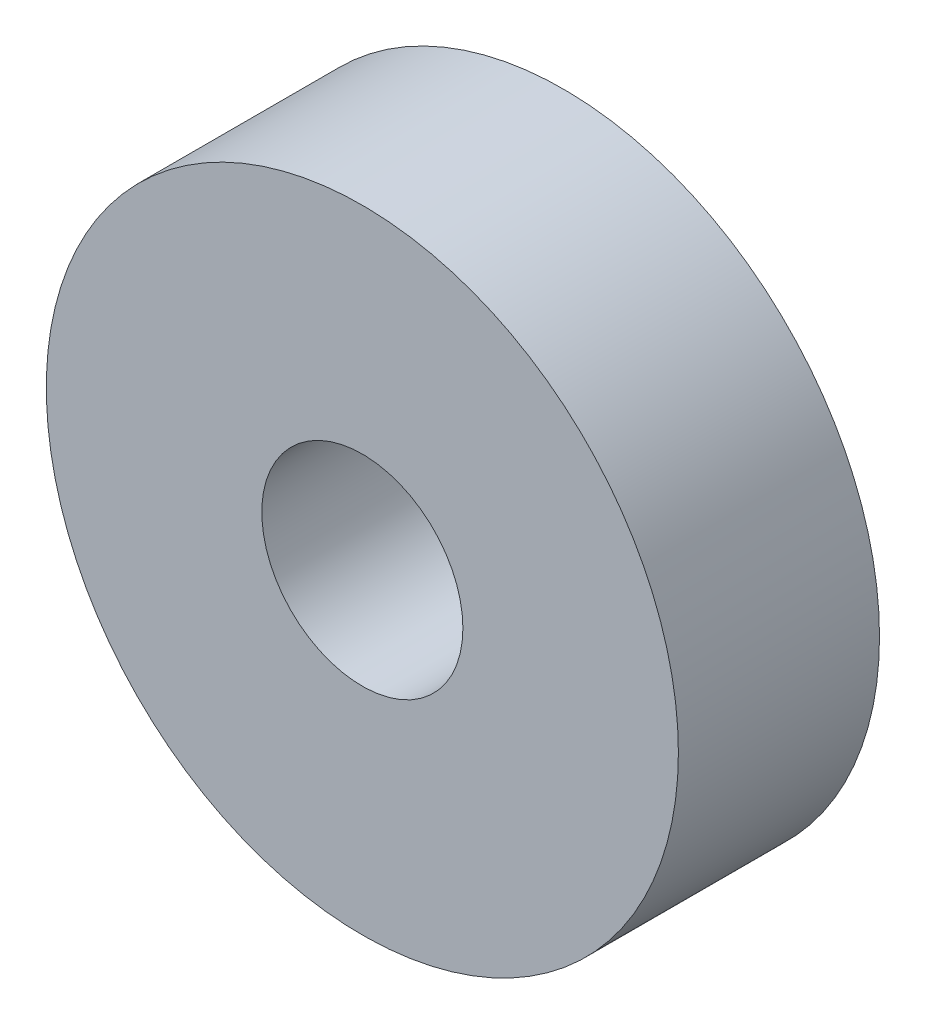
ISO-10303-21;
HEADER;
FILE_DESCRIPTION(('STEP AP214'),'2;1');
FILE_NAME('part.step','',(''),(''),'','','');
FILE_SCHEMA(('AUTOMOTIVE_DESIGN { 1 0 10303 214 1 1 1 1 }'));
ENDSEC;
DATA;
#1=APPLICATION_CONTEXT('core data for automotive mechanical design processes');
#2=APPLICATION_PROTOCOL_DEFINITION('international standard','automotive_design',2000,#1);
#3=PRODUCT_CONTEXT('',#1,'mechanical');
#4=PRODUCT('Part','Part','',(#3));
#5=PRODUCT_RELATED_PRODUCT_CATEGORY('part','',(#4));
#6=PRODUCT_DEFINITION_FORMATION('','',#4);
#7=PRODUCT_DEFINITION_CONTEXT('part definition',#1,'design');
#8=PRODUCT_DEFINITION('design','',#6,#7);
#9=PRODUCT_DEFINITION_SHAPE('','',#8);
#10=(LENGTH_UNIT() NAMED_UNIT(*) SI_UNIT(.MILLI.,.METRE.));
#11=(NAMED_UNIT(*) PLANE_ANGLE_UNIT() SI_UNIT($,.RADIAN.));
#12=(NAMED_UNIT(*) SI_UNIT($,.STERADIAN.) SOLID_ANGLE_UNIT());
#13=UNCERTAINTY_MEASURE_WITH_UNIT(LENGTH_MEASURE(1.E-05),#10,'distance_accuracy_value','');
#14=(GEOMETRIC_REPRESENTATION_CONTEXT(3) GLOBAL_UNCERTAINTY_ASSIGNED_CONTEXT((#13)) GLOBAL_UNIT_ASSIGNED_CONTEXT((#10,
#11,#12)) REPRESENTATION_CONTEXT('',''));
#15=CARTESIAN_POINT('',(0.,0.,0.));
#16=DIRECTION('',(0.,0.,1.));
#17=DIRECTION('',(1.,0.,0.));
#18=AXIS2_PLACEMENT_3D('',#15,#16,#17);
#19=CARTESIAN_POINT('',(0.,0.,3.5));
#20=DIRECTION('',(0.,0.,1.));
#21=DIRECTION('',(1.,0.,0.));
#22=AXIS2_PLACEMENT_3D('',#19,#20,#21);
#23=PLANE('',#22);
#24=CARTESIAN_POINT('',(0.,0.,3.5));
#25=DIRECTION('',(0.,0.,1.));
#26=DIRECTION('',(1.,0.,0.));
#27=AXIS2_PLACEMENT_3D('',#24,#25,#26);
#28=CIRCLE('',#27,11.);
#29=CARTESIAN_POINT('',(11.,0.,3.5));
#30=VERTEX_POINT('',#29);
#31=EDGE_CURVE('E10',#30,#30,#28,.T.);
#32=ORIENTED_EDGE('',*,*,#31,.T.);
#33=EDGE_LOOP('',(#32));
#34=FACE_BOUND('',#33,.T.);
#35=CARTESIAN_POINT('',(0.,0.,3.5));
#36=DIRECTION('',(0.,0.,1.));
#37=DIRECTION('',(1.,0.,0.));
#38=AXIS2_PLACEMENT_3D('',#35,#36,#37);
#39=CIRCLE('',#38,3.5);
#40=CARTESIAN_POINT('',(3.5,0.,3.5));
#41=VERTEX_POINT('',#40);
#42=EDGE_CURVE('E48',#41,#41,#39,.T.);
#43=ORIENTED_EDGE('',*,*,#42,.F.);
#44=EDGE_LOOP('',(#43));
#45=FACE_BOUND('',#44,.T.);
#46=ADVANCED_FACE('F37',(#34,#45),#23,.T.);
#47=CARTESIAN_POINT('',(0.,0.,-3.5));
#48=DIRECTION('',(0.,0.,1.));
#49=DIRECTION('',(1.,0.,0.));
#50=AXIS2_PLACEMENT_3D('',#47,#48,#49);
#51=PLANE('',#50);
#52=CARTESIAN_POINT('',(0.,0.,-3.5));
#53=DIRECTION('',(0.,0.,1.));
#54=DIRECTION('',(1.,0.,0.));
#55=AXIS2_PLACEMENT_3D('',#52,#53,#54);
#56=CIRCLE('',#55,11.);
#57=CARTESIAN_POINT('',(11.,0.,-3.5));
#58=VERTEX_POINT('',#57);
#59=EDGE_CURVE('E41',#58,#58,#56,.T.);
#60=ORIENTED_EDGE('',*,*,#59,.F.);
#61=EDGE_LOOP('',(#60));
#62=FACE_BOUND('',#61,.T.);
#63=CARTESIAN_POINT('',(0.,0.,-3.5));
#64=DIRECTION('',(0.,0.,1.));
#65=DIRECTION('',(1.,0.,0.));
#66=AXIS2_PLACEMENT_3D('',#63,#64,#65);
#67=CIRCLE('',#66,3.5);
#68=CARTESIAN_POINT('',(3.5,0.,-3.5));
#69=VERTEX_POINT('',#68);
#70=EDGE_CURVE('E50',#69,#69,#67,.T.);
#71=ORIENTED_EDGE('',*,*,#70,.T.);
#72=EDGE_LOOP('',(#71));
#73=FACE_BOUND('',#72,.T.);
#74=ADVANCED_FACE('F60',(#62,#73),#51,.F.);
#75=CARTESIAN_POINT('',(0.,0.,3.5));
#76=DIRECTION('',(0.,0.,-1.));
#77=DIRECTION('',(-1.,0.,0.));
#78=AXIS2_PLACEMENT_3D('',#75,#76,#77);
#79=CYLINDRICAL_SURFACE('',#78,11.);
#80=ORIENTED_EDGE('',*,*,#31,.F.);
#81=EDGE_LOOP('',(#80));
#82=FACE_BOUND('',#81,.T.);
#83=ORIENTED_EDGE('',*,*,#59,.T.);
#84=EDGE_LOOP('',(#83));
#85=FACE_BOUND('',#84,.T.);
#86=ADVANCED_FACE('F39',(#82,#85),#79,.T.);
#87=CARTESIAN_POINT('',(0.,0.,3.5));
#88=DIRECTION('',(0.,0.,-1.));
#89=DIRECTION('',(-1.,0.,0.));
#90=AXIS2_PLACEMENT_3D('',#87,#88,#89);
#91=CYLINDRICAL_SURFACE('',#90,3.5);
#92=ORIENTED_EDGE('',*,*,#42,.T.);
#93=EDGE_LOOP('',(#92));
#94=FACE_BOUND('',#93,.T.);
#95=ORIENTED_EDGE('',*,*,#70,.F.);
#96=EDGE_LOOP('',(#95));
#97=FACE_BOUND('',#96,.T.);
#98=ADVANCED_FACE('F56',(#94,#97),#91,.F.);
#99=CLOSED_SHELL('',(#46,#74,#86,#98));
#100=MANIFOLD_SOLID_BREP('B2',#99);
#101=ADVANCED_BREP_SHAPE_REPRESENTATION('',(#18,#100),#14);
#102=SHAPE_DEFINITION_REPRESENTATION(#9,#101);
ENDSEC;
END-ISO-10303-21;
